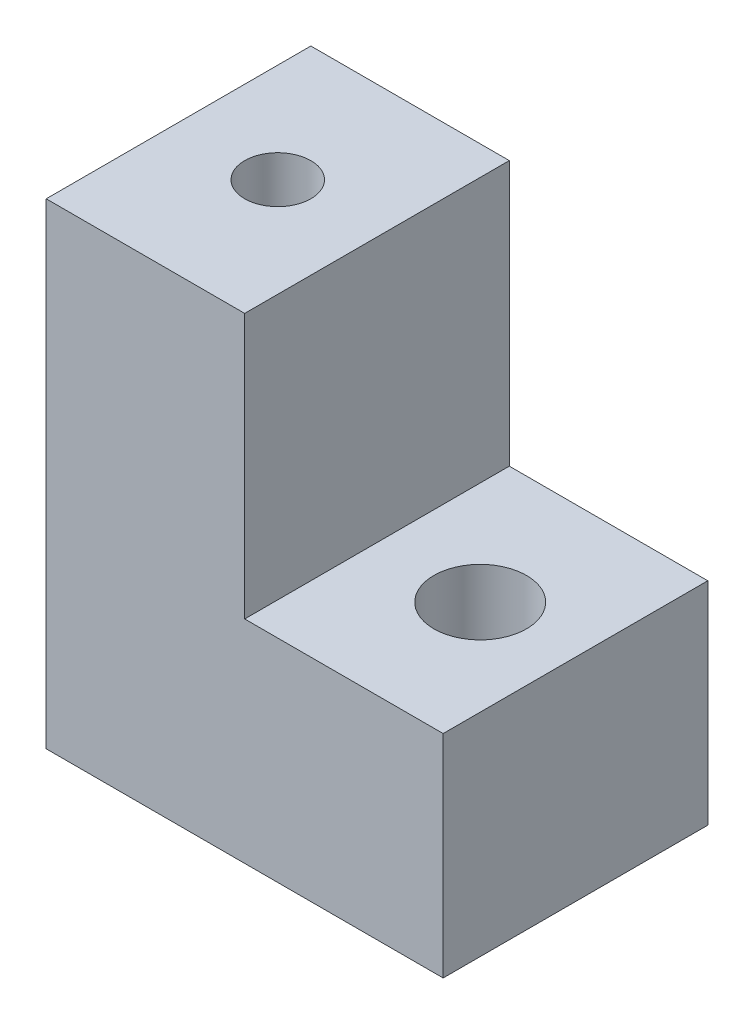
ISO-10303-21;
HEADER;
FILE_DESCRIPTION(('STEP AP214'),'2;1');
FILE_NAME('part.step','',(''),(''),'','','');
FILE_SCHEMA(('AUTOMOTIVE_DESIGN { 1 0 10303 214 1 1 1 1 }'));
ENDSEC;
DATA;
#1=APPLICATION_CONTEXT('core data for automotive mechanical design processes');
#2=APPLICATION_PROTOCOL_DEFINITION('international standard','automotive_design',2000,#1);
#3=PRODUCT_CONTEXT('',#1,'mechanical');
#4=PRODUCT('Part','Part','',(#3));
#5=PRODUCT_RELATED_PRODUCT_CATEGORY('part','',(#4));
#6=PRODUCT_DEFINITION_FORMATION('','',#4);
#7=PRODUCT_DEFINITION_CONTEXT('part definition',#1,'design');
#8=PRODUCT_DEFINITION('design','',#6,#7);
#9=PRODUCT_DEFINITION_SHAPE('','',#8);
#10=(LENGTH_UNIT() NAMED_UNIT(*) SI_UNIT(.MILLI.,.METRE.));
#11=(NAMED_UNIT(*) PLANE_ANGLE_UNIT() SI_UNIT($,.RADIAN.));
#12=(NAMED_UNIT(*) SI_UNIT($,.STERADIAN.) SOLID_ANGLE_UNIT());
#13=UNCERTAINTY_MEASURE_WITH_UNIT(LENGTH_MEASURE(1.E-05),#10,'distance_accuracy_value','');
#14=(GEOMETRIC_REPRESENTATION_CONTEXT(3) GLOBAL_UNCERTAINTY_ASSIGNED_CONTEXT((#13)) GLOBAL_UNIT_ASSIGNED_CONTEXT((#10,
#11,#12)) REPRESENTATION_CONTEXT('',''));
#15=CARTESIAN_POINT('',(0.,0.,0.));
#16=DIRECTION('',(0.,0.,1.));
#17=DIRECTION('',(1.,0.,0.));
#18=AXIS2_PLACEMENT_3D('',#15,#16,#17);
#19=CARTESIAN_POINT('',(-7.5,8.,10.));
#20=DIRECTION('',(0.,1.,0.));
#21=DIRECTION('',(0.,0.,1.));
#22=AXIS2_PLACEMENT_3D('',#19,#20,#21);
#23=PLANE('',#22);
#24=CARTESIAN_POINT('',(-3.6,8.,5.));
#25=DIRECTION('',(0.,1.,0.));
#26=DIRECTION('',(0.,0.,1.));
#27=AXIS2_PLACEMENT_3D('',#24,#25,#26);
#28=CIRCLE('',#27,1.75);
#29=CARTESIAN_POINT('',(-3.6,8.,6.75));
#30=VERTEX_POINT('',#29);
#31=EDGE_CURVE('E218',#30,#30,#28,.T.);
#32=ORIENTED_EDGE('',*,*,#31,.F.);
#33=EDGE_LOOP('',(#32));
#34=FACE_BOUND('',#33,.T.);
#35=DIRECTION('',(1.,0.,0.));
#36=VECTOR('',#35,1.);
#37=CARTESIAN_POINT('',(-7.5,8.,0.));
#38=LINE('',#37,#36);
#39=CARTESIAN_POINT('',(-7.5,8.,0.));
#40=VERTEX_POINT('',#39);
#41=CARTESIAN_POINT('',(0.,8.,0.));
#42=VERTEX_POINT('',#41);
#43=EDGE_CURVE('E122',#40,#42,#38,.T.);
#44=ORIENTED_EDGE('',*,*,#43,.F.);
#45=DIRECTION('',(0.,0.,-1.));
#46=VECTOR('',#45,1.);
#47=CARTESIAN_POINT('',(-7.5,8.,10.));
#48=LINE('',#47,#46);
#49=CARTESIAN_POINT('',(-7.5,8.,10.));
#50=VERTEX_POINT('',#49);
#51=EDGE_CURVE('E11',#50,#40,#48,.T.);
#52=ORIENTED_EDGE('',*,*,#51,.F.);
#53=DIRECTION('',(1.,0.,0.));
#54=VECTOR('',#53,1.);
#55=CARTESIAN_POINT('',(-7.5,8.,10.));
#56=LINE('',#55,#54);
#57=CARTESIAN_POINT('',(0.,8.,10.));
#58=VERTEX_POINT('',#57);
#59=EDGE_CURVE('E137',#50,#58,#56,.T.);
#60=ORIENTED_EDGE('',*,*,#59,.T.);
#61=DIRECTION('',(0.,0.,-1.));
#62=VECTOR('',#61,1.);
#63=CARTESIAN_POINT('',(0.,8.,10.));
#64=LINE('',#63,#62);
#65=EDGE_CURVE('E40',#58,#42,#64,.T.);
#66=ORIENTED_EDGE('',*,*,#65,.T.);
#67=EDGE_LOOP('',(#44,#52,#60,#66));
#68=FACE_BOUND('',#67,.T.);
#69=ADVANCED_FACE('F37',(#34,#68),#23,.T.);
#70=CARTESIAN_POINT('',(-7.5,18.,10.));
#71=DIRECTION('',(1.,0.,0.));
#72=DIRECTION('',(0.,1.,0.));
#73=AXIS2_PLACEMENT_3D('',#70,#71,#72);
#74=PLANE('',#73);
#75=DIRECTION('',(0.,-1.,0.));
#76=VECTOR('',#75,1.);
#77=CARTESIAN_POINT('',(-7.5,18.,0.));
#78=LINE('',#77,#76);
#79=CARTESIAN_POINT('',(-7.5,18.,0.));
#80=VERTEX_POINT('',#79);
#81=EDGE_CURVE('E135',#80,#40,#78,.T.);
#82=ORIENTED_EDGE('',*,*,#81,.F.);
#83=DIRECTION('',(0.,0.,-1.));
#84=VECTOR('',#83,1.);
#85=CARTESIAN_POINT('',(-7.5,18.,10.));
#86=LINE('',#85,#84);
#87=CARTESIAN_POINT('',(-7.5,18.,10.));
#88=VERTEX_POINT('',#87);
#89=EDGE_CURVE('E46',#88,#80,#86,.T.);
#90=ORIENTED_EDGE('',*,*,#89,.F.);
#91=DIRECTION('',(0.,-1.,0.));
#92=VECTOR('',#91,1.);
#93=CARTESIAN_POINT('',(-7.5,18.,10.));
#94=LINE('',#93,#92);
#95=EDGE_CURVE('E112',#88,#50,#94,.T.);
#96=ORIENTED_EDGE('',*,*,#95,.T.);
#97=ORIENTED_EDGE('',*,*,#51,.T.);
#98=EDGE_LOOP('',(#82,#90,#96,#97));
#99=FACE_BOUND('',#98,.T.);
#100=ADVANCED_FACE('F145',(#99),#74,.T.);
#101=CARTESIAN_POINT('',(-15.,18.,10.));
#102=DIRECTION('',(0.,1.,0.));
#103=DIRECTION('',(0.,0.,1.));
#104=AXIS2_PLACEMENT_3D('',#101,#102,#103);
#105=PLANE('',#104);
#106=CARTESIAN_POINT('',(-11.25,18.,5.));
#107=DIRECTION('',(0.,-1.,0.));
#108=DIRECTION('',(0.,0.,-1.));
#109=AXIS2_PLACEMENT_3D('',#106,#107,#108);
#110=CIRCLE('',#109,1.24999999999999);
#111=CARTESIAN_POINT('',(-11.25,18.,3.75000000000001));
#112=VERTEX_POINT('',#111);
#113=EDGE_CURVE('E199',#112,#112,#110,.T.);
#114=ORIENTED_EDGE('',*,*,#113,.T.);
#115=EDGE_LOOP('',(#114));
#116=FACE_BOUND('',#115,.T.);
#117=DIRECTION('',(1.,0.,0.));
#118=VECTOR('',#117,1.);
#119=CARTESIAN_POINT('',(-15.,18.,0.));
#120=LINE('',#119,#118);
#121=CARTESIAN_POINT('',(-15.,18.,0.));
#122=VERTEX_POINT('',#121);
#123=EDGE_CURVE('E99',#122,#80,#120,.T.);
#124=ORIENTED_EDGE('',*,*,#123,.F.);
#125=DIRECTION('',(0.,0.,-1.));
#126=VECTOR('',#125,1.);
#127=CARTESIAN_POINT('',(-15.,18.,10.));
#128=LINE('',#127,#126);
#129=CARTESIAN_POINT('',(-15.,18.,10.));
#130=VERTEX_POINT('',#129);
#131=EDGE_CURVE('E94',#130,#122,#128,.T.);
#132=ORIENTED_EDGE('',*,*,#131,.F.);
#133=DIRECTION('',(1.,0.,0.));
#134=VECTOR('',#133,1.);
#135=CARTESIAN_POINT('',(-15.,18.,10.));
#136=LINE('',#135,#134);
#137=EDGE_CURVE('E97',#130,#88,#136,.T.);
#138=ORIENTED_EDGE('',*,*,#137,.T.);
#139=ORIENTED_EDGE('',*,*,#89,.T.);
#140=EDGE_LOOP('',(#124,#132,#138,#139));
#141=FACE_BOUND('',#140,.T.);
#142=ADVANCED_FACE('F96',(#116,#141),#105,.T.);
#143=CARTESIAN_POINT('',(-15.,0.,10.));
#144=DIRECTION('',(-1.,0.,0.));
#145=DIRECTION('',(0.,0.,1.));
#146=AXIS2_PLACEMENT_3D('',#143,#144,#145);
#147=PLANE('',#146);
#148=DIRECTION('',(0.,1.,0.));
#149=VECTOR('',#148,1.);
#150=CARTESIAN_POINT('',(-15.,0.,0.));
#151=LINE('',#150,#149);
#152=CARTESIAN_POINT('',(-15.,0.,0.));
#153=VERTEX_POINT('',#152);
#154=EDGE_CURVE('E132',#153,#122,#151,.T.);
#155=ORIENTED_EDGE('',*,*,#154,.F.);
#156=DIRECTION('',(0.,0.,-1.));
#157=VECTOR('',#156,1.);
#158=CARTESIAN_POINT('',(-15.,0.,10.));
#159=LINE('',#158,#157);
#160=CARTESIAN_POINT('',(-15.,0.,10.));
#161=VERTEX_POINT('',#160);
#162=EDGE_CURVE('E104',#161,#153,#159,.T.);
#163=ORIENTED_EDGE('',*,*,#162,.F.);
#164=DIRECTION('',(0.,1.,0.));
#165=VECTOR('',#164,1.);
#166=CARTESIAN_POINT('',(-15.,0.,10.));
#167=LINE('',#166,#165);
#168=EDGE_CURVE('E110',#161,#130,#167,.T.);
#169=ORIENTED_EDGE('',*,*,#168,.T.);
#170=ORIENTED_EDGE('',*,*,#131,.T.);
#171=EDGE_LOOP('',(#155,#163,#169,#170));
#172=FACE_BOUND('',#171,.T.);
#173=ADVANCED_FACE('F114',(#172),#147,.T.);
#174=CARTESIAN_POINT('',(0.,0.,10.));
#175=DIRECTION('',(0.,-1.,0.));
#176=DIRECTION('',(0.,0.,-1.));
#177=AXIS2_PLACEMENT_3D('',#174,#175,#176);
#178=PLANE('',#177);
#179=CARTESIAN_POINT('',(-11.25,0.,5.));
#180=DIRECTION('',(0.,-1.,0.));
#181=DIRECTION('',(0.,0.,-1.));
#182=AXIS2_PLACEMENT_3D('',#179,#180,#181);
#183=CIRCLE('',#182,1.75);
#184=CARTESIAN_POINT('',(-11.25,0.,3.25));
#185=VERTEX_POINT('',#184);
#186=EDGE_CURVE('E204',#185,#185,#183,.T.);
#187=ORIENTED_EDGE('',*,*,#186,.F.);
#188=EDGE_LOOP('',(#187));
#189=FACE_BOUND('',#188,.T.);
#190=CARTESIAN_POINT('',(-3.6,0.,5.));
#191=DIRECTION('',(0.,1.,0.));
#192=DIRECTION('',(0.,0.,1.));
#193=AXIS2_PLACEMENT_3D('',#190,#191,#192);
#194=CIRCLE('',#193,1.24999999999999);
#195=CARTESIAN_POINT('',(-3.6,0.,6.24999999999999));
#196=VERTEX_POINT('',#195);
#197=EDGE_CURVE('E215',#196,#196,#194,.T.);
#198=ORIENTED_EDGE('',*,*,#197,.T.);
#199=EDGE_LOOP('',(#198));
#200=FACE_BOUND('',#199,.T.);
#201=DIRECTION('',(-1.,0.,0.));
#202=VECTOR('',#201,1.);
#203=CARTESIAN_POINT('',(0.,0.,0.));
#204=LINE('',#203,#202);
#205=CARTESIAN_POINT('',(0.,0.,0.));
#206=VERTEX_POINT('',#205);
#207=EDGE_CURVE('E129',#206,#153,#204,.T.);
#208=ORIENTED_EDGE('',*,*,#207,.F.);
#209=DIRECTION('',(0.,0.,-1.));
#210=VECTOR('',#209,1.);
#211=CARTESIAN_POINT('',(0.,0.,10.));
#212=LINE('',#211,#210);
#213=CARTESIAN_POINT('',(0.,0.,10.));
#214=VERTEX_POINT('',#213);
#215=EDGE_CURVE('E140',#214,#206,#212,.T.);
#216=ORIENTED_EDGE('',*,*,#215,.F.);
#217=DIRECTION('',(-1.,0.,0.));
#218=VECTOR('',#217,1.);
#219=CARTESIAN_POINT('',(0.,0.,10.));
#220=LINE('',#219,#218);
#221=EDGE_CURVE('E115',#214,#161,#220,.T.);
#222=ORIENTED_EDGE('',*,*,#221,.T.);
#223=ORIENTED_EDGE('',*,*,#162,.T.);
#224=EDGE_LOOP('',(#208,#216,#222,#223));
#225=FACE_BOUND('',#224,.T.);
#226=ADVANCED_FACE('F160',(#189,#200,#225),#178,.T.);
#227=CARTESIAN_POINT('',(0.,8.,10.));
#228=DIRECTION('',(1.,0.,0.));
#229=DIRECTION('',(0.,0.,-1.));
#230=AXIS2_PLACEMENT_3D('',#227,#228,#229);
#231=PLANE('',#230);
#232=DIRECTION('',(0.,-1.,0.));
#233=VECTOR('',#232,1.);
#234=CARTESIAN_POINT('',(0.,8.,0.));
#235=LINE('',#234,#233);
#236=EDGE_CURVE('E125',#42,#206,#235,.T.);
#237=ORIENTED_EDGE('',*,*,#236,.F.);
#238=ORIENTED_EDGE('',*,*,#65,.F.);
#239=DIRECTION('',(0.,-1.,0.));
#240=VECTOR('',#239,1.);
#241=CARTESIAN_POINT('',(0.,8.,10.));
#242=LINE('',#241,#240);
#243=EDGE_CURVE('E117',#58,#214,#242,.T.);
#244=ORIENTED_EDGE('',*,*,#243,.T.);
#245=ORIENTED_EDGE('',*,*,#215,.T.);
#246=EDGE_LOOP('',(#237,#238,#244,#245));
#247=FACE_BOUND('',#246,.T.);
#248=ADVANCED_FACE('F142',(#247),#231,.T.);
#249=CARTESIAN_POINT('',(0.,0.,10.));
#250=DIRECTION('',(0.,0.,-1.));
#251=DIRECTION('',(-1.,0.,0.));
#252=AXIS2_PLACEMENT_3D('',#249,#250,#251);
#253=PLANE('',#252);
#254=ORIENTED_EDGE('',*,*,#59,.F.);
#255=ORIENTED_EDGE('',*,*,#95,.F.);
#256=ORIENTED_EDGE('',*,*,#137,.F.);
#257=ORIENTED_EDGE('',*,*,#168,.F.);
#258=ORIENTED_EDGE('',*,*,#221,.F.);
#259=ORIENTED_EDGE('',*,*,#243,.F.);
#260=EDGE_LOOP('',(#254,#255,#256,#257,#258,#259));
#261=FACE_BOUND('',#260,.T.);
#262=ADVANCED_FACE('F108',(#261),#253,.F.);
#263=CARTESIAN_POINT('',(0.,0.,0.));
#264=DIRECTION('',(0.,0.,-1.));
#265=DIRECTION('',(-1.,0.,0.));
#266=AXIS2_PLACEMENT_3D('',#263,#264,#265);
#267=PLANE('',#266);
#268=ORIENTED_EDGE('',*,*,#43,.T.);
#269=ORIENTED_EDGE('',*,*,#236,.T.);
#270=ORIENTED_EDGE('',*,*,#207,.T.);
#271=ORIENTED_EDGE('',*,*,#154,.T.);
#272=ORIENTED_EDGE('',*,*,#123,.T.);
#273=ORIENTED_EDGE('',*,*,#81,.T.);
#274=EDGE_LOOP('',(#268,#269,#270,#271,#272,#273));
#275=FACE_BOUND('',#274,.T.);
#276=ADVANCED_FACE('F144',(#275),#267,.T.);
#277=CARTESIAN_POINT('',(-3.6,2.,5.));
#278=DIRECTION('',(0.,1.,0.));
#279=DIRECTION('',(0.,0.,1.));
#280=AXIS2_PLACEMENT_3D('',#277,#278,#279);
#281=CYLINDRICAL_SURFACE('',#280,1.75);
#282=CARTESIAN_POINT('',(-3.6,2.,5.));
#283=DIRECTION('',(0.,1.,0.));
#284=DIRECTION('',(0.,0.,1.));
#285=AXIS2_PLACEMENT_3D('',#282,#283,#284);
#286=CIRCLE('',#285,1.75);
#287=CARTESIAN_POINT('',(-3.6,2.,6.75));
#288=VERTEX_POINT('',#287);
#289=EDGE_CURVE('E126',#288,#288,#286,.T.);
#290=ORIENTED_EDGE('',*,*,#289,.F.);
#291=EDGE_LOOP('',(#290));
#292=FACE_BOUND('',#291,.T.);
#293=ORIENTED_EDGE('',*,*,#31,.T.);
#294=EDGE_LOOP('',(#293));
#295=FACE_BOUND('',#294,.T.);
#296=ADVANCED_FACE('F170',(#292,#295),#281,.F.);
#297=CARTESIAN_POINT('',(-3.6,2.,5.));
#298=DIRECTION('',(0.,1.,0.));
#299=DIRECTION('',(0.,0.,1.));
#300=AXIS2_PLACEMENT_3D('',#297,#298,#299);
#301=PLANE('',#300);
#302=CARTESIAN_POINT('',(-3.6,2.,5.));
#303=DIRECTION('',(0.,1.,0.));
#304=DIRECTION('',(0.,0.,1.));
#305=AXIS2_PLACEMENT_3D('',#302,#303,#304);
#306=CIRCLE('',#305,1.24999999999999);
#307=CARTESIAN_POINT('',(-3.6,2.,6.24999999999999));
#308=VERTEX_POINT('',#307);
#309=EDGE_CURVE('E210',#308,#308,#306,.T.);
#310=ORIENTED_EDGE('',*,*,#309,.F.);
#311=EDGE_LOOP('',(#310));
#312=FACE_BOUND('',#311,.T.);
#313=ORIENTED_EDGE('',*,*,#289,.T.);
#314=EDGE_LOOP('',(#313));
#315=FACE_BOUND('',#314,.T.);
#316=ADVANCED_FACE('F174',(#312,#315),#301,.T.);
#317=CARTESIAN_POINT('',(-3.6,2.,5.));
#318=DIRECTION('',(0.,1.,0.));
#319=DIRECTION('',(0.,0.,1.));
#320=AXIS2_PLACEMENT_3D('',#317,#318,#319);
#321=CYLINDRICAL_SURFACE('',#320,1.24999999999999);
#322=ORIENTED_EDGE('',*,*,#197,.F.);
#323=EDGE_LOOP('',(#322));
#324=FACE_BOUND('',#323,.T.);
#325=ORIENTED_EDGE('',*,*,#309,.T.);
#326=EDGE_LOOP('',(#325));
#327=FACE_BOUND('',#326,.T.);
#328=ADVANCED_FACE('F178',(#324,#327),#321,.F.);
#329=CARTESIAN_POINT('',(-11.25,15.,5.));
#330=DIRECTION('',(0.,-1.,0.));
#331=DIRECTION('',(0.,0.,-1.));
#332=AXIS2_PLACEMENT_3D('',#329,#330,#331);
#333=CYLINDRICAL_SURFACE('',#332,1.75);
#334=CARTESIAN_POINT('',(-11.25,15.,5.));
#335=DIRECTION('',(0.,-1.,0.));
#336=DIRECTION('',(0.,0.,-1.));
#337=AXIS2_PLACEMENT_3D('',#334,#335,#336);
#338=CIRCLE('',#337,1.75);
#339=CARTESIAN_POINT('',(-11.25,15.,3.25));
#340=VERTEX_POINT('',#339);
#341=EDGE_CURVE('E207',#340,#340,#338,.T.);
#342=ORIENTED_EDGE('',*,*,#341,.F.);
#343=EDGE_LOOP('',(#342));
#344=FACE_BOUND('',#343,.T.);
#345=ORIENTED_EDGE('',*,*,#186,.T.);
#346=EDGE_LOOP('',(#345));
#347=FACE_BOUND('',#346,.T.);
#348=ADVANCED_FACE('F182',(#344,#347),#333,.F.);
#349=CARTESIAN_POINT('',(-11.25,15.,5.));
#350=DIRECTION('',(0.,-1.,0.));
#351=DIRECTION('',(0.,0.,-1.));
#352=AXIS2_PLACEMENT_3D('',#349,#350,#351);
#353=PLANE('',#352);
#354=CARTESIAN_POINT('',(-11.25,15.,5.));
#355=DIRECTION('',(0.,-1.,0.));
#356=DIRECTION('',(0.,0.,-1.));
#357=AXIS2_PLACEMENT_3D('',#354,#355,#356);
#358=CIRCLE('',#357,1.24999999999999);
#359=CARTESIAN_POINT('',(-11.25,15.,3.75000000000001));
#360=VERTEX_POINT('',#359);
#361=EDGE_CURVE('E202',#360,#360,#358,.T.);
#362=ORIENTED_EDGE('',*,*,#361,.F.);
#363=EDGE_LOOP('',(#362));
#364=FACE_BOUND('',#363,.T.);
#365=ORIENTED_EDGE('',*,*,#341,.T.);
#366=EDGE_LOOP('',(#365));
#367=FACE_BOUND('',#366,.T.);
#368=ADVANCED_FACE('F186',(#364,#367),#353,.T.);
#369=CARTESIAN_POINT('',(-11.25,15.,5.));
#370=DIRECTION('',(0.,-1.,0.));
#371=DIRECTION('',(0.,0.,-1.));
#372=AXIS2_PLACEMENT_3D('',#369,#370,#371);
#373=CYLINDRICAL_SURFACE('',#372,1.24999999999999);
#374=ORIENTED_EDGE('',*,*,#113,.F.);
#375=EDGE_LOOP('',(#374));
#376=FACE_BOUND('',#375,.T.);
#377=ORIENTED_EDGE('',*,*,#361,.T.);
#378=EDGE_LOOP('',(#377));
#379=FACE_BOUND('',#378,.T.);
#380=ADVANCED_FACE('F190',(#376,#379),#373,.F.);
#381=CLOSED_SHELL('',(#69,#100,#142,#173,#226,#248,#262,#276,#296,#316,#328,#348,#368,#380));
#382=MANIFOLD_SOLID_BREP('B2',#381);
#383=ADVANCED_BREP_SHAPE_REPRESENTATION('',(#18,#382),#14);
#384=SHAPE_DEFINITION_REPRESENTATION(#9,#383);
ENDSEC;
END-ISO-10303-21;
